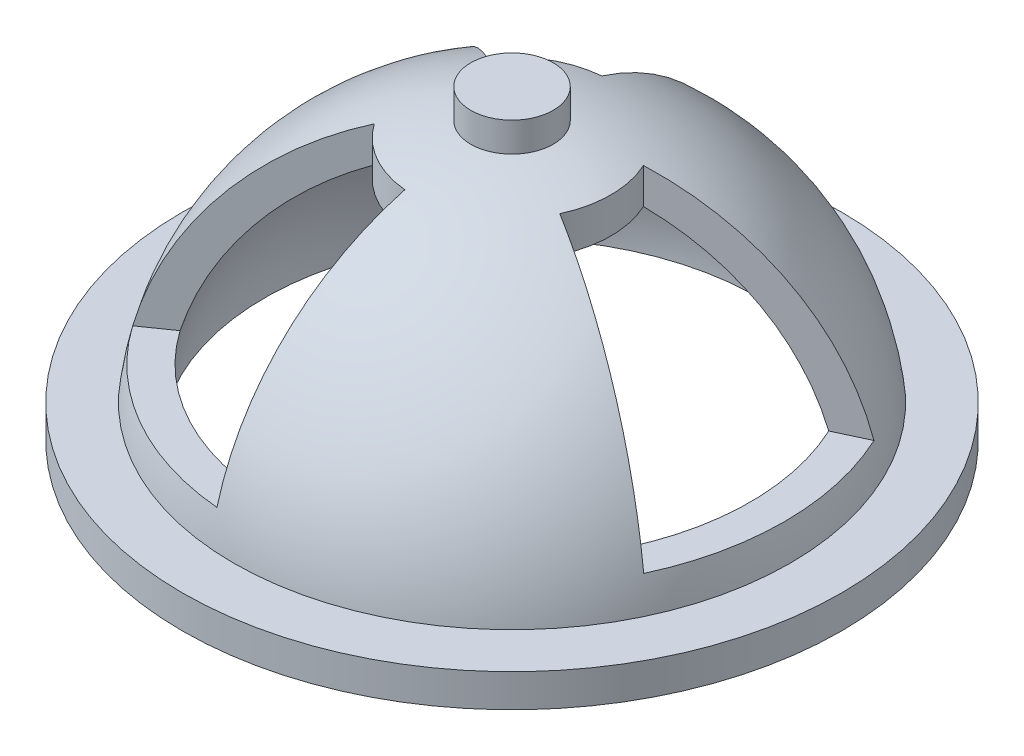
ISO-10303-21;
HEADER;
FILE_DESCRIPTION(('STEP AP214'),'2;1');
FILE_NAME('part.step','',(''),(''),'','','');
FILE_SCHEMA(('AUTOMOTIVE_DESIGN { 1 0 10303 214 1 1 1 1 }'));
ENDSEC;
DATA;
#1=APPLICATION_CONTEXT('core data for automotive mechanical design processes');
#2=APPLICATION_PROTOCOL_DEFINITION('international standard','automotive_design',2000,#1);
#3=PRODUCT_CONTEXT('',#1,'mechanical');
#4=PRODUCT('Part','Part','',(#3));
#5=PRODUCT_RELATED_PRODUCT_CATEGORY('part','',(#4));
#6=PRODUCT_DEFINITION_FORMATION('','',#4);
#7=PRODUCT_DEFINITION_CONTEXT('part definition',#1,'design');
#8=PRODUCT_DEFINITION('design','',#6,#7);
#9=PRODUCT_DEFINITION_SHAPE('','',#8);
#10=(LENGTH_UNIT() NAMED_UNIT(*) SI_UNIT(.MILLI.,.METRE.));
#11=(NAMED_UNIT(*) PLANE_ANGLE_UNIT() SI_UNIT($,.RADIAN.));
#12=(NAMED_UNIT(*) SI_UNIT($,.STERADIAN.) SOLID_ANGLE_UNIT());
#13=UNCERTAINTY_MEASURE_WITH_UNIT(LENGTH_MEASURE(1.E-05),#10,'distance_accuracy_value','');
#14=(GEOMETRIC_REPRESENTATION_CONTEXT(3) GLOBAL_UNCERTAINTY_ASSIGNED_CONTEXT((#13)) GLOBAL_UNIT_ASSIGNED_CONTEXT((#10,
#11,#12)) REPRESENTATION_CONTEXT('',''));
#15=CARTESIAN_POINT('',(0.,0.,0.));
#16=DIRECTION('',(0.,0.,1.));
#17=DIRECTION('',(1.,0.,0.));
#18=AXIS2_PLACEMENT_3D('',#15,#16,#17);
#19=CARTESIAN_POINT('',(0.,0.,0.));
#20=DIRECTION('',(0.,1.,0.));
#21=DIRECTION('',(0.,0.,1.));
#22=AXIS2_PLACEMENT_3D('',#19,#20,#21);
#23=SPHERICAL_SURFACE('',#22,42.5);
#24=CARTESIAN_POINT('',(0.,5.,0.));
#25=DIRECTION('',(0.,1.,0.));
#26=DIRECTION('',(0.,0.,1.));
#27=AXIS2_PLACEMENT_3D('',#24,#25,#26);
#28=CIRCLE('',#27,42.2048575403353);
#29=CARTESIAN_POINT('',(0.,5.,42.2048575403353));
#30=VERTEX_POINT('',#29);
#31=EDGE_CURVE('E237',#30,#30,#28,.T.);
#32=ORIENTED_EDGE('',*,*,#31,.T.);
#33=EDGE_LOOP('',(#32));
#34=FACE_BOUND('',#33,.T.);
#35=CARTESIAN_POINT('',(0.,42.0379293020006,0.));
#36=DIRECTION('',(0.,1.,0.));
#37=DIRECTION('',(0.,0.,1.));
#38=AXIS2_PLACEMENT_3D('',#35,#36,#37);
#39=CIRCLE('',#38,6.25);
#40=CARTESIAN_POINT('',(0.,42.0379293020006,6.25));
#41=VERTEX_POINT('',#40);
#42=EDGE_CURVE('E47',#41,#41,#39,.T.);
#43=ORIENTED_EDGE('',*,*,#42,.F.);
#44=EDGE_LOOP('',(#43));
#45=FACE_BOUND('',#44,.T.);
#46=CARTESIAN_POINT('',(0.,0.,0.));
#47=DIRECTION('',(-0.996194698091746,0.,0.0871557427476479));
#48=DIRECTION('',(0.0871557427476479,0.,0.996194698091746));
#49=AXIS2_PLACEMENT_3D('',#46,#47,#48);
#50=CIRCLE('',#49,42.5);
#51=CARTESIAN_POINT('',(-1.30733614121472,39.7649343014672,-14.9429204713762));
#52=VERTEX_POINT('',#51);
#53=CARTESIAN_POINT('',(-3.60012301337843,10.,-41.1495943392951));
#54=VERTEX_POINT('',#53);
#55=EDGE_CURVE('E217',#52,#54,#50,.T.);
#56=ORIENTED_EDGE('',*,*,#55,.F.);
#57=CARTESIAN_POINT('',(0.,39.7649343014672,0.));
#58=DIRECTION('',(0.,-1.,0.));
#59=DIRECTION('',(0.,0.,-1.));
#60=AXIS2_PLACEMENT_3D('',#57,#58,#59);
#61=CIRCLE('',#60,15.);
#62=CARTESIAN_POINT('',(-12.2872806643348,39.7649343014672,-8.60364654526579));
#63=VERTEX_POINT('',#62);
#64=EDGE_CURVE('E214',#63,#52,#61,.T.);
#65=ORIENTED_EDGE('',*,*,#64,.F.);
#66=CARTESIAN_POINT('',(0.,0.,0.));
#67=DIRECTION('',(0.573576436351053,0.,-0.819152044288987));
#68=DIRECTION('',(-0.819152044288987,0.,-0.573576436351053));
#69=AXIS2_PLACEMENT_3D('',#66,#67,#68);
#70=CIRCLE('',#69,42.5);
#71=CARTESIAN_POINT('',(-33.8365325465642,10.,-23.6925951559829));
#72=VERTEX_POINT('',#71);
#73=EDGE_CURVE('E219',#72,#63,#70,.T.);
#74=ORIENTED_EDGE('',*,*,#73,.F.);
#75=CARTESIAN_POINT('',(0.,10.,0.));
#76=DIRECTION('',(0.,1.,0.));
#77=DIRECTION('',(0.,0.,1.));
#78=AXIS2_PLACEMENT_3D('',#75,#76,#77);
#79=CIRCLE('',#78,41.3067791046458);
#80=EDGE_CURVE('E198',#54,#72,#79,.T.);
#81=ORIENTED_EDGE('',*,*,#80,.F.);
#82=EDGE_LOOP('',(#56,#65,#74,#81));
#83=FACE_BOUND('',#82,.T.);
#84=CARTESIAN_POINT('',(0.,0.,0.));
#85=DIRECTION('',(0.573576436351041,0.,0.819152044288995));
#86=DIRECTION('',(0.819152044288995,0.,-0.573576436351041));
#87=AXIS2_PLACEMENT_3D('',#84,#85,#86);
#88=CIRCLE('',#87,42.5);
#89=CARTESIAN_POINT('',(-12.2872806643349,39.7649343014672,8.60364654526562));
#90=VERTEX_POINT('',#89);
#91=CARTESIAN_POINT('',(-33.8365325465645,10.,23.6925951559824));
#92=VERTEX_POINT('',#91);
#93=EDGE_CURVE('E62',#90,#92,#88,.T.);
#94=ORIENTED_EDGE('',*,*,#93,.F.);
#95=CARTESIAN_POINT('',(0.,39.7649343014672,0.));
#96=DIRECTION('',(0.,-1.,0.));
#97=DIRECTION('',(0.,0.,-1.));
#98=AXIS2_PLACEMENT_3D('',#95,#96,#97);
#99=CIRCLE('',#98,15.);
#100=CARTESIAN_POINT('',(-1.30733614121493,39.7649343014672,14.9429204713762));
#101=VERTEX_POINT('',#100);
#102=EDGE_CURVE('E184',#101,#90,#99,.T.);
#103=ORIENTED_EDGE('',*,*,#102,.F.);
#104=CARTESIAN_POINT('',(0.,0.,0.));
#105=DIRECTION('',(-0.996194698091745,0.,-0.0871557427476617));
#106=DIRECTION('',(-0.0871557427476617,0.,0.996194698091745));
#107=AXIS2_PLACEMENT_3D('',#104,#105,#106);
#108=CIRCLE('',#107,42.5);
#109=CARTESIAN_POINT('',(-3.600123013379,10.,41.149594339295));
#110=VERTEX_POINT('',#109);
#111=EDGE_CURVE('E188',#110,#101,#108,.T.);
#112=ORIENTED_EDGE('',*,*,#111,.F.);
#113=CARTESIAN_POINT('',(0.,10.,0.));
#114=DIRECTION('',(0.,1.,0.));
#115=DIRECTION('',(0.,0.,1.));
#116=AXIS2_PLACEMENT_3D('',#113,#114,#115);
#117=CIRCLE('',#116,41.3067791046458);
#118=EDGE_CURVE('E168',#92,#110,#117,.T.);
#119=ORIENTED_EDGE('',*,*,#118,.F.);
#120=EDGE_LOOP('',(#94,#103,#112,#119));
#121=FACE_BOUND('',#120,.T.);
#122=CARTESIAN_POINT('',(0.,0.,0.));
#123=DIRECTION('',(0.4226182617407,0.,-0.906307787036649));
#124=DIRECTION('',(-0.906307787036649,0.,-0.4226182617407));
#125=AXIS2_PLACEMENT_3D('',#122,#123,#124);
#126=CIRCLE('',#125,42.5);
#127=CARTESIAN_POINT('',(13.5946168055497,39.7649343014672,6.3392739261105));
#128=VERTEX_POINT('',#127);
#129=CARTESIAN_POINT('',(37.4366555599432,10.,17.4569991833125));
#130=VERTEX_POINT('',#129);
#131=EDGE_CURVE('E54',#128,#130,#126,.T.);
#132=ORIENTED_EDGE('',*,*,#131,.F.);
#133=CARTESIAN_POINT('',(0.,39.7649343014672,0.));
#134=DIRECTION('',(0.,-1.,0.));
#135=DIRECTION('',(0.,0.,-1.));
#136=AXIS2_PLACEMENT_3D('',#133,#134,#135);
#137=CIRCLE('',#136,15.);
#138=CARTESIAN_POINT('',(13.5946168055497,39.7649343014672,-6.3392739261105));
#139=VERTEX_POINT('',#138);
#140=EDGE_CURVE('E136',#139,#128,#137,.T.);
#141=ORIENTED_EDGE('',*,*,#140,.F.);
#142=CARTESIAN_POINT('',(0.,0.,0.));
#143=DIRECTION('',(0.4226182617407,0.,0.906307787036649));
#144=DIRECTION('',(0.906307787036649,0.,-0.4226182617407));
#145=AXIS2_PLACEMENT_3D('',#142,#143,#144);
#146=CIRCLE('',#145,42.5);
#147=CARTESIAN_POINT('',(37.4366555599432,10.,-17.4569991833125));
#148=VERTEX_POINT('',#147);
#149=EDGE_CURVE('E152',#148,#139,#146,.T.);
#150=ORIENTED_EDGE('',*,*,#149,.F.);
#151=CARTESIAN_POINT('',(0.,10.,0.));
#152=DIRECTION('',(0.,1.,0.));
#153=DIRECTION('',(0.,0.,1.));
#154=AXIS2_PLACEMENT_3D('',#151,#152,#153);
#155=CIRCLE('',#154,41.3067791046458);
#156=EDGE_CURVE('E144',#130,#148,#155,.T.);
#157=ORIENTED_EDGE('',*,*,#156,.F.);
#158=EDGE_LOOP('',(#132,#141,#150,#157));
#159=FACE_BOUND('',#158,.T.);
#160=ADVANCED_FACE('F39',(#34,#45,#83,#121,#159),#23,.T.);
#161=CARTESIAN_POINT('',(0.,0.,0.));
#162=DIRECTION('',(0.,1.,0.));
#163=DIRECTION('',(0.,0.,1.));
#164=AXIS2_PLACEMENT_3D('',#161,#162,#163);
#165=SPHERICAL_SURFACE('',#164,37.5);
#166=CARTESIAN_POINT('',(0.,0.,0.));
#167=DIRECTION('',(0.,1.,0.));
#168=DIRECTION('',(0.,0.,1.));
#169=AXIS2_PLACEMENT_3D('',#166,#167,#168);
#170=CIRCLE('',#169,37.5);
#171=CARTESIAN_POINT('',(0.,0.,37.5));
#172=VERTEX_POINT('',#171);
#173=EDGE_CURVE('E167',#172,#172,#170,.T.);
#174=ORIENTED_EDGE('',*,*,#173,.F.);
#175=EDGE_LOOP('',(#174));
#176=FACE_BOUND('',#175,.T.);
#177=CARTESIAN_POINT('',(0.,0.,0.));
#178=DIRECTION('',(0.573576436351053,0.,-0.819152044288987));
#179=DIRECTION('',(-0.819152044288987,0.,-0.573576436351053));
#180=AXIS2_PLACEMENT_3D('',#177,#178,#179);
#181=CIRCLE('',#180,37.5);
#182=CARTESIAN_POINT('',(-12.2872806643348,34.3693177121688,-8.60364654526579));
#183=VERTEX_POINT('',#182);
#184=CARTESIAN_POINT('',(-29.6058593205731,10.,-20.7302458714419));
#185=VERTEX_POINT('',#184);
#186=EDGE_CURVE('E172',#183,#185,#181,.F.);
#187=ORIENTED_EDGE('',*,*,#186,.F.);
#188=CARTESIAN_POINT('',(0.,34.3693177121688,0.));
#189=DIRECTION('',(0.,-1.,0.));
#190=DIRECTION('',(0.,0.,-1.));
#191=AXIS2_PLACEMENT_3D('',#188,#189,#190);
#192=CIRCLE('',#191,15.);
#193=CARTESIAN_POINT('',(-1.30733614121472,34.3693177121688,-14.9429204713762));
#194=VERTEX_POINT('',#193);
#195=EDGE_CURVE('E222',#194,#183,#192,.F.);
#196=ORIENTED_EDGE('',*,*,#195,.F.);
#197=CARTESIAN_POINT('',(0.,0.,0.));
#198=DIRECTION('',(-0.996194698091746,0.,0.0871557427476479));
#199=DIRECTION('',(0.0871557427476479,0.,0.996194698091746));
#200=AXIS2_PLACEMENT_3D('',#197,#198,#199);
#201=CIRCLE('',#200,37.5);
#202=CARTESIAN_POINT('',(-3.1499898910789,10.,-36.0045492082056));
#203=VERTEX_POINT('',#202);
#204=EDGE_CURVE('E225',#203,#194,#201,.F.);
#205=ORIENTED_EDGE('',*,*,#204,.F.);
#206=CARTESIAN_POINT('',(0.,10.,0.));
#207=DIRECTION('',(0.,1.,0.));
#208=DIRECTION('',(0.,0.,1.));
#209=AXIS2_PLACEMENT_3D('',#206,#207,#208);
#210=CIRCLE('',#209,36.1420807370024);
#211=EDGE_CURVE('E201',#185,#203,#210,.F.);
#212=ORIENTED_EDGE('',*,*,#211,.F.);
#213=EDGE_LOOP('',(#187,#196,#205,#212));
#214=FACE_BOUND('',#213,.T.);
#215=CARTESIAN_POINT('',(0.,0.,0.));
#216=DIRECTION('',(-0.996194698091745,0.,-0.0871557427476617));
#217=DIRECTION('',(-0.0871557427476617,0.,0.996194698091745));
#218=AXIS2_PLACEMENT_3D('',#215,#216,#217);
#219=CIRCLE('',#218,37.5);
#220=CARTESIAN_POINT('',(-1.30733614121493,34.3693177121688,14.9429204713762));
#221=VERTEX_POINT('',#220);
#222=CARTESIAN_POINT('',(-3.1499898910794,10.,36.0045492082056));
#223=VERTEX_POINT('',#222);
#224=EDGE_CURVE('E154',#221,#223,#219,.F.);
#225=ORIENTED_EDGE('',*,*,#224,.F.);
#226=CARTESIAN_POINT('',(0.,34.3693177121688,0.));
#227=DIRECTION('',(0.,-1.,0.));
#228=DIRECTION('',(0.,0.,-1.));
#229=AXIS2_PLACEMENT_3D('',#226,#227,#228);
#230=CIRCLE('',#229,15.);
#231=CARTESIAN_POINT('',(-12.2872806643349,34.3693177121688,8.60364654526562));
#232=VERTEX_POINT('',#231);
#233=EDGE_CURVE('E191',#232,#221,#230,.F.);
#234=ORIENTED_EDGE('',*,*,#233,.F.);
#235=CARTESIAN_POINT('',(0.,0.,0.));
#236=DIRECTION('',(0.573576436351041,0.,0.819152044288995));
#237=DIRECTION('',(0.819152044288995,0.,-0.573576436351041));
#238=AXIS2_PLACEMENT_3D('',#235,#236,#237);
#239=CIRCLE('',#238,37.5);
#240=CARTESIAN_POINT('',(-29.6058593205734,10.,20.7302458714415));
#241=VERTEX_POINT('',#240);
#242=EDGE_CURVE('E194',#241,#232,#239,.F.);
#243=ORIENTED_EDGE('',*,*,#242,.F.);
#244=CARTESIAN_POINT('',(0.,10.,0.));
#245=DIRECTION('',(0.,1.,0.));
#246=DIRECTION('',(0.,0.,1.));
#247=AXIS2_PLACEMENT_3D('',#244,#245,#246);
#248=CIRCLE('',#247,36.1420807370024);
#249=EDGE_CURVE('E171',#223,#241,#248,.F.);
#250=ORIENTED_EDGE('',*,*,#249,.F.);
#251=EDGE_LOOP('',(#225,#234,#243,#250));
#252=FACE_BOUND('',#251,.T.);
#253=CARTESIAN_POINT('',(0.,0.,0.));
#254=DIRECTION('',(0.4226182617407,0.,0.906307787036649));
#255=DIRECTION('',(0.906307787036649,0.,-0.4226182617407));
#256=AXIS2_PLACEMENT_3D('',#253,#254,#255);
#257=CIRCLE('',#256,37.5);
#258=CARTESIAN_POINT('',(13.5946168055497,34.3693177121688,-6.3392739261105));
#259=VERTEX_POINT('',#258);
#260=CARTESIAN_POINT('',(32.7558492116526,10.,-15.274303336764));
#261=VERTEX_POINT('',#260);
#262=EDGE_CURVE('E150',#259,#261,#257,.F.);
#263=ORIENTED_EDGE('',*,*,#262,.F.);
#264=CARTESIAN_POINT('',(0.,34.3693177121688,0.));
#265=DIRECTION('',(0.,-1.,0.));
#266=DIRECTION('',(0.,0.,-1.));
#267=AXIS2_PLACEMENT_3D('',#264,#265,#266);
#268=CIRCLE('',#267,15.);
#269=CARTESIAN_POINT('',(13.5946168055497,34.3693177121688,6.3392739261105));
#270=VERTEX_POINT('',#269);
#271=EDGE_CURVE('E149',#270,#259,#268,.F.);
#272=ORIENTED_EDGE('',*,*,#271,.F.);
#273=CARTESIAN_POINT('',(0.,0.,0.));
#274=DIRECTION('',(0.4226182617407,0.,-0.906307787036649));
#275=DIRECTION('',(-0.906307787036649,0.,-0.4226182617407));
#276=AXIS2_PLACEMENT_3D('',#273,#274,#275);
#277=CIRCLE('',#276,37.5);
#278=CARTESIAN_POINT('',(32.7558492116526,10.,15.274303336764));
#279=VERTEX_POINT('',#278);
#280=EDGE_CURVE('E130',#279,#270,#277,.F.);
#281=ORIENTED_EDGE('',*,*,#280,.F.);
#282=CARTESIAN_POINT('',(0.,10.,0.));
#283=DIRECTION('',(0.,1.,0.));
#284=DIRECTION('',(0.,0.,1.));
#285=AXIS2_PLACEMENT_3D('',#282,#283,#284);
#286=CIRCLE('',#285,36.1420807370024);
#287=EDGE_CURVE('E140',#261,#279,#286,.F.);
#288=ORIENTED_EDGE('',*,*,#287,.F.);
#289=EDGE_LOOP('',(#263,#272,#281,#288));
#290=FACE_BOUND('',#289,.T.);
#291=ADVANCED_FACE('F147',(#176,#214,#252,#290),#165,.F.);
#292=CARTESIAN_POINT('',(0.,46.5,6.25));
#293=DIRECTION('',(0.,1.,0.));
#294=DIRECTION('',(0.,0.,1.));
#295=AXIS2_PLACEMENT_3D('',#292,#293,#294);
#296=PLANE('',#295);
#297=CARTESIAN_POINT('',(0.,46.5,0.));
#298=DIRECTION('',(0.,1.,0.));
#299=DIRECTION('',(0.,0.,1.));
#300=AXIS2_PLACEMENT_3D('',#297,#298,#299);
#301=CIRCLE('',#300,6.25);
#302=CARTESIAN_POINT('',(0.,46.5,6.25));
#303=VERTEX_POINT('',#302);
#304=EDGE_CURVE('E11',#303,#303,#301,.T.);
#305=ORIENTED_EDGE('',*,*,#304,.T.);
#306=EDGE_LOOP('',(#305));
#307=FACE_BOUND('',#306,.T.);
#308=ADVANCED_FACE('F41',(#307),#296,.T.);
#309=CARTESIAN_POINT('',(0.,58.3340154537581,0.));
#310=DIRECTION('',(0.,1.,0.));
#311=DIRECTION('',(0.,0.,1.));
#312=AXIS2_PLACEMENT_3D('',#309,#310,#311);
#313=CYLINDRICAL_SURFACE('',#312,6.25);
#314=ORIENTED_EDGE('',*,*,#42,.T.);
#315=EDGE_LOOP('',(#314));
#316=FACE_BOUND('',#315,.T.);
#317=ORIENTED_EDGE('',*,*,#304,.F.);
#318=EDGE_LOOP('',(#317));
#319=FACE_BOUND('',#318,.T.);
#320=ADVANCED_FACE('F242',(#316,#319),#313,.T.);
#321=CARTESIAN_POINT('',(0.,5.,50.));
#322=DIRECTION('',(0.,1.,0.));
#323=DIRECTION('',(0.,0.,1.));
#324=AXIS2_PLACEMENT_3D('',#321,#322,#323);
#325=PLANE('',#324);
#326=CARTESIAN_POINT('',(0.,5.,0.));
#327=DIRECTION('',(0.,1.,0.));
#328=DIRECTION('',(0.,0.,1.));
#329=AXIS2_PLACEMENT_3D('',#326,#327,#328);
#330=CIRCLE('',#329,50.);
#331=CARTESIAN_POINT('',(0.,5.,50.));
#332=VERTEX_POINT('',#331);
#333=EDGE_CURVE('E234',#332,#332,#330,.T.);
#334=ORIENTED_EDGE('',*,*,#333,.T.);
#335=EDGE_LOOP('',(#334));
#336=FACE_BOUND('',#335,.T.);
#337=ORIENTED_EDGE('',*,*,#31,.F.);
#338=EDGE_LOOP('',(#337));
#339=FACE_BOUND('',#338,.T.);
#340=ADVANCED_FACE('F311',(#336,#339),#325,.T.);
#341=CARTESIAN_POINT('',(0.,58.3340154537581,0.));
#342=DIRECTION('',(0.,1.,0.));
#343=DIRECTION('',(0.,0.,1.));
#344=AXIS2_PLACEMENT_3D('',#341,#342,#343);
#345=CYLINDRICAL_SURFACE('',#344,50.);
#346=CARTESIAN_POINT('',(0.,0.,0.));
#347=DIRECTION('',(0.,1.,0.));
#348=DIRECTION('',(0.,0.,1.));
#349=AXIS2_PLACEMENT_3D('',#346,#347,#348);
#350=CIRCLE('',#349,50.);
#351=CARTESIAN_POINT('',(0.,0.,50.));
#352=VERTEX_POINT('',#351);
#353=EDGE_CURVE('E231',#352,#352,#350,.T.);
#354=ORIENTED_EDGE('',*,*,#353,.T.);
#355=EDGE_LOOP('',(#354));
#356=FACE_BOUND('',#355,.T.);
#357=ORIENTED_EDGE('',*,*,#333,.F.);
#358=EDGE_LOOP('',(#357));
#359=FACE_BOUND('',#358,.T.);
#360=ADVANCED_FACE('F307',(#356,#359),#345,.T.);
#361=CARTESIAN_POINT('',(0.,0.,50.));
#362=DIRECTION('',(0.,-1.,0.));
#363=DIRECTION('',(0.,0.,-1.));
#364=AXIS2_PLACEMENT_3D('',#361,#362,#363);
#365=PLANE('',#364);
#366=ORIENTED_EDGE('',*,*,#173,.T.);
#367=EDGE_LOOP('',(#366));
#368=FACE_BOUND('',#367,.T.);
#369=ORIENTED_EDGE('',*,*,#353,.F.);
#370=EDGE_LOOP('',(#369));
#371=FACE_BOUND('',#370,.T.);
#372=ADVANCED_FACE('F290',(#368,#371),#365,.T.);
#373=CARTESIAN_POINT('',(0.,46.501,0.));
#374=DIRECTION('',(0.,-1.,0.));
#375=DIRECTION('',(0.,0.,-1.));
#376=AXIS2_PLACEMENT_3D('',#373,#374,#375);
#377=CYLINDRICAL_SURFACE('',#376,15.);
#378=ORIENTED_EDGE('',*,*,#64,.T.);
#379=DIRECTION('',(0.,-1.,0.));
#380=VECTOR('',#379,1.);
#381=CARTESIAN_POINT('',(-1.30733614121472,46.501,-14.9429204713762));
#382=LINE('',#381,#380);
#383=EDGE_CURVE('E204',#52,#194,#382,.T.);
#384=ORIENTED_EDGE('',*,*,#383,.T.);
#385=ORIENTED_EDGE('',*,*,#195,.T.);
#386=DIRECTION('',(0.,-1.,0.));
#387=VECTOR('',#386,1.);
#388=CARTESIAN_POINT('',(-12.2872806643348,46.501,-8.60364654526579));
#389=LINE('',#388,#387);
#390=EDGE_CURVE('E206',#63,#183,#389,.T.);
#391=ORIENTED_EDGE('',*,*,#390,.F.);
#392=EDGE_LOOP('',(#378,#384,#385,#391));
#393=FACE_BOUND('',#392,.T.);
#394=ADVANCED_FACE('F286',(#393),#377,.T.);
#395=CARTESIAN_POINT('',(-1.30733614121472,46.501,-14.9429204713762));
#396=DIRECTION('',(-0.996194698091746,0.,0.0871557427476479));
#397=DIRECTION('',(0.0871557427476479,0.,0.996194698091746));
#398=AXIS2_PLACEMENT_3D('',#395,#396,#397);
#399=PLANE('',#398);
#400=ORIENTED_EDGE('',*,*,#55,.T.);
#401=DIRECTION('',(-0.0871557427476479,0.,-0.996194698091746));
#402=VECTOR('',#401,1.);
#403=CARTESIAN_POINT('',(-1.30733614121472,10.,-14.9429204713762));
#404=LINE('',#403,#402);
#405=EDGE_CURVE('E211',#203,#54,#404,.T.);
#406=ORIENTED_EDGE('',*,*,#405,.F.);
#407=ORIENTED_EDGE('',*,*,#204,.T.);
#408=ORIENTED_EDGE('',*,*,#383,.F.);
#409=EDGE_LOOP('',(#400,#406,#407,#408));
#410=FACE_BOUND('',#409,.T.);
#411=ADVANCED_FACE('F289',(#410),#399,.T.);
#412=CARTESIAN_POINT('',(-12.2872806643348,46.501,-8.60364654526579));
#413=DIRECTION('',(0.573576436351053,0.,-0.819152044288987));
#414=DIRECTION('',(-0.819152044288987,0.,-0.573576436351053));
#415=AXIS2_PLACEMENT_3D('',#412,#413,#414);
#416=PLANE('',#415);
#417=ORIENTED_EDGE('',*,*,#73,.T.);
#418=ORIENTED_EDGE('',*,*,#390,.T.);
#419=ORIENTED_EDGE('',*,*,#186,.T.);
#420=DIRECTION('',(0.819152044288987,0.,0.573576436351053));
#421=VECTOR('',#420,1.);
#422=CARTESIAN_POINT('',(-12.2872806643348,10.,-8.60364654526579));
#423=LINE('',#422,#421);
#424=EDGE_CURVE('E208',#72,#185,#423,.T.);
#425=ORIENTED_EDGE('',*,*,#424,.F.);
#426=EDGE_LOOP('',(#417,#418,#419,#425));
#427=FACE_BOUND('',#426,.T.);
#428=ADVANCED_FACE('F294',(#427),#416,.T.);
#429=CARTESIAN_POINT('',(0.,10.,0.));
#430=DIRECTION('',(0.,1.,0.));
#431=DIRECTION('',(0.,0.,1.));
#432=AXIS2_PLACEMENT_3D('',#429,#430,#431);
#433=PLANE('',#432);
#434=ORIENTED_EDGE('',*,*,#80,.T.);
#435=ORIENTED_EDGE('',*,*,#424,.T.);
#436=ORIENTED_EDGE('',*,*,#211,.T.);
#437=ORIENTED_EDGE('',*,*,#405,.T.);
#438=EDGE_LOOP('',(#434,#435,#436,#437));
#439=FACE_BOUND('',#438,.T.);
#440=ADVANCED_FACE('F279',(#439),#433,.T.);
#441=CARTESIAN_POINT('',(0.,46.501,0.));
#442=DIRECTION('',(0.,-1.,0.));
#443=DIRECTION('',(0.,0.,-1.));
#444=AXIS2_PLACEMENT_3D('',#441,#442,#443);
#445=CYLINDRICAL_SURFACE('',#444,15.);
#446=ORIENTED_EDGE('',*,*,#102,.T.);
#447=DIRECTION('',(0.,-1.,0.));
#448=VECTOR('',#447,1.);
#449=CARTESIAN_POINT('',(-12.2872806643349,46.501,8.60364654526562));
#450=LINE('',#449,#448);
#451=EDGE_CURVE('E175',#90,#232,#450,.T.);
#452=ORIENTED_EDGE('',*,*,#451,.T.);
#453=ORIENTED_EDGE('',*,*,#233,.T.);
#454=DIRECTION('',(0.,-1.,0.));
#455=VECTOR('',#454,1.);
#456=CARTESIAN_POINT('',(-1.30733614121493,46.501,14.9429204713762));
#457=LINE('',#456,#455);
#458=EDGE_CURVE('E177',#101,#221,#457,.T.);
#459=ORIENTED_EDGE('',*,*,#458,.F.);
#460=EDGE_LOOP('',(#446,#452,#453,#459));
#461=FACE_BOUND('',#460,.T.);
#462=ADVANCED_FACE('F275',(#461),#445,.T.);
#463=CARTESIAN_POINT('',(-12.2872806643349,46.501,8.60364654526562));
#464=DIRECTION('',(0.573576436351041,0.,0.819152044288995));
#465=DIRECTION('',(0.819152044288995,0.,-0.573576436351041));
#466=AXIS2_PLACEMENT_3D('',#463,#464,#465);
#467=PLANE('',#466);
#468=ORIENTED_EDGE('',*,*,#93,.T.);
#469=DIRECTION('',(-0.819152044288995,0.,0.573576436351041));
#470=VECTOR('',#469,1.);
#471=CARTESIAN_POINT('',(-12.2872806643349,10.,8.60364654526562));
#472=LINE('',#471,#470);
#473=EDGE_CURVE('E182',#241,#92,#472,.T.);
#474=ORIENTED_EDGE('',*,*,#473,.F.);
#475=ORIENTED_EDGE('',*,*,#242,.T.);
#476=ORIENTED_EDGE('',*,*,#451,.F.);
#477=EDGE_LOOP('',(#468,#474,#475,#476));
#478=FACE_BOUND('',#477,.T.);
#479=ADVANCED_FACE('F278',(#478),#467,.T.);
#480=CARTESIAN_POINT('',(-1.30733614121493,46.501,14.9429204713762));
#481=DIRECTION('',(-0.996194698091745,0.,-0.0871557427476617));
#482=DIRECTION('',(-0.0871557427476617,0.,0.996194698091745));
#483=AXIS2_PLACEMENT_3D('',#480,#481,#482);
#484=PLANE('',#483);
#485=ORIENTED_EDGE('',*,*,#111,.T.);
#486=ORIENTED_EDGE('',*,*,#458,.T.);
#487=ORIENTED_EDGE('',*,*,#224,.T.);
#488=DIRECTION('',(0.0871557427476617,0.,-0.996194698091745));
#489=VECTOR('',#488,1.);
#490=CARTESIAN_POINT('',(-1.30733614121493,10.,14.9429204713762));
#491=LINE('',#490,#489);
#492=EDGE_CURVE('E179',#110,#223,#491,.T.);
#493=ORIENTED_EDGE('',*,*,#492,.F.);
#494=EDGE_LOOP('',(#485,#486,#487,#493));
#495=FACE_BOUND('',#494,.T.);
#496=ADVANCED_FACE('F270',(#495),#484,.T.);
#497=CARTESIAN_POINT('',(0.,10.,0.));
#498=DIRECTION('',(0.,1.,0.));
#499=DIRECTION('',(0.,0.,1.));
#500=AXIS2_PLACEMENT_3D('',#497,#498,#499);
#501=PLANE('',#500);
#502=ORIENTED_EDGE('',*,*,#118,.T.);
#503=ORIENTED_EDGE('',*,*,#492,.T.);
#504=ORIENTED_EDGE('',*,*,#249,.T.);
#505=ORIENTED_EDGE('',*,*,#473,.T.);
#506=EDGE_LOOP('',(#502,#503,#504,#505));
#507=FACE_BOUND('',#506,.T.);
#508=ADVANCED_FACE('F263',(#507),#501,.T.);
#509=CARTESIAN_POINT('',(0.,46.501,0.));
#510=DIRECTION('',(0.,-1.,0.));
#511=DIRECTION('',(0.,0.,-1.));
#512=AXIS2_PLACEMENT_3D('',#509,#510,#511);
#513=CYLINDRICAL_SURFACE('',#512,15.);
#514=ORIENTED_EDGE('',*,*,#140,.T.);
#515=DIRECTION('',(0.,-1.,0.));
#516=VECTOR('',#515,1.);
#517=CARTESIAN_POINT('',(13.5946168055497,46.501,6.33927392611051));
#518=LINE('',#517,#516);
#519=EDGE_CURVE('E145',#128,#270,#518,.T.);
#520=ORIENTED_EDGE('',*,*,#519,.T.);
#521=ORIENTED_EDGE('',*,*,#271,.T.);
#522=DIRECTION('',(0.,-1.,0.));
#523=VECTOR('',#522,1.);
#524=CARTESIAN_POINT('',(13.5946168055497,46.501,-6.3392739261105));
#525=LINE('',#524,#523);
#526=EDGE_CURVE('E163',#139,#259,#525,.T.);
#527=ORIENTED_EDGE('',*,*,#526,.F.);
#528=EDGE_LOOP('',(#514,#520,#521,#527));
#529=FACE_BOUND('',#528,.T.);
#530=ADVANCED_FACE('F261',(#529),#513,.T.);
#531=CARTESIAN_POINT('',(13.5946168055497,46.501,6.33927392611051));
#532=DIRECTION('',(0.4226182617407,0.,-0.906307787036649));
#533=DIRECTION('',(-0.906307787036649,0.,-0.4226182617407));
#534=AXIS2_PLACEMENT_3D('',#531,#532,#533);
#535=PLANE('',#534);
#536=ORIENTED_EDGE('',*,*,#131,.T.);
#537=DIRECTION('',(0.906307787036649,0.,0.4226182617407));
#538=VECTOR('',#537,1.);
#539=CARTESIAN_POINT('',(13.5946168055497,10.,6.33927392611051));
#540=LINE('',#539,#538);
#541=EDGE_CURVE('E126',#279,#130,#540,.T.);
#542=ORIENTED_EDGE('',*,*,#541,.F.);
#543=ORIENTED_EDGE('',*,*,#280,.T.);
#544=ORIENTED_EDGE('',*,*,#519,.F.);
#545=EDGE_LOOP('',(#536,#542,#543,#544));
#546=FACE_BOUND('',#545,.T.);
#547=ADVANCED_FACE('F128',(#546),#535,.T.);
#548=CARTESIAN_POINT('',(13.5946168055497,46.501,-6.3392739261105));
#549=DIRECTION('',(0.4226182617407,0.,0.906307787036649));
#550=DIRECTION('',(0.906307787036649,0.,-0.4226182617407));
#551=AXIS2_PLACEMENT_3D('',#548,#549,#550);
#552=PLANE('',#551);
#553=ORIENTED_EDGE('',*,*,#149,.T.);
#554=ORIENTED_EDGE('',*,*,#526,.T.);
#555=ORIENTED_EDGE('',*,*,#262,.T.);
#556=DIRECTION('',(-0.906307787036649,0.,0.4226182617407));
#557=VECTOR('',#556,1.);
#558=CARTESIAN_POINT('',(13.5946168055497,10.,-6.3392739261105));
#559=LINE('',#558,#557);
#560=EDGE_CURVE('E135',#148,#261,#559,.T.);
#561=ORIENTED_EDGE('',*,*,#560,.F.);
#562=EDGE_LOOP('',(#553,#554,#555,#561));
#563=FACE_BOUND('',#562,.T.);
#564=ADVANCED_FACE('F259',(#563),#552,.T.);
#565=CARTESIAN_POINT('',(0.,10.,0.));
#566=DIRECTION('',(0.,1.,0.));
#567=DIRECTION('',(0.,0.,1.));
#568=AXIS2_PLACEMENT_3D('',#565,#566,#567);
#569=PLANE('',#568);
#570=ORIENTED_EDGE('',*,*,#156,.T.);
#571=ORIENTED_EDGE('',*,*,#560,.T.);
#572=ORIENTED_EDGE('',*,*,#287,.T.);
#573=ORIENTED_EDGE('',*,*,#541,.T.);
#574=EDGE_LOOP('',(#570,#571,#572,#573));
#575=FACE_BOUND('',#574,.T.);
#576=ADVANCED_FACE('F141',(#575),#569,.T.);
#577=CLOSED_SHELL('',(#160,#291,#308,#320,#340,#360,#372,#394,#411,#428,#440,#462,#479,#496,
#508,#530,#547,#564,#576));
#578=MANIFOLD_SOLID_BREP('B2',#577);
#579=ADVANCED_BREP_SHAPE_REPRESENTATION('',(#18,#578),#14);
#580=SHAPE_DEFINITION_REPRESENTATION(#9,#579);
ENDSEC;
END-ISO-10303-21;
